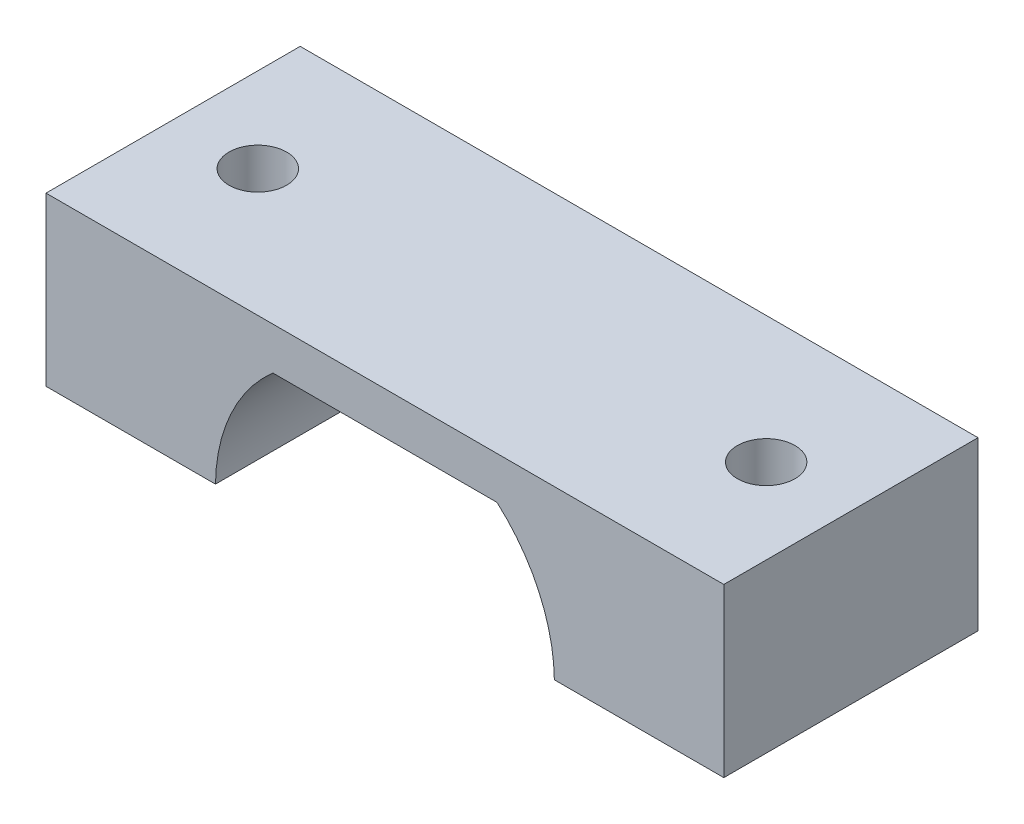
ISO-10303-21;
HEADER;
FILE_DESCRIPTION(('STEP AP214'),'2;1');
FILE_NAME('part.step','',(''),(''),'','','');
FILE_SCHEMA(('AUTOMOTIVE_DESIGN { 1 0 10303 214 1 1 1 1 }'));
ENDSEC;
DATA;
#1=APPLICATION_CONTEXT('core data for automotive mechanical design processes');
#2=APPLICATION_PROTOCOL_DEFINITION('international standard','automotive_design',2000,#1);
#3=PRODUCT_CONTEXT('',#1,'mechanical');
#4=PRODUCT('Part','Part','',(#3));
#5=PRODUCT_RELATED_PRODUCT_CATEGORY('part','',(#4));
#6=PRODUCT_DEFINITION_FORMATION('','',#4);
#7=PRODUCT_DEFINITION_CONTEXT('part definition',#1,'design');
#8=PRODUCT_DEFINITION('design','',#6,#7);
#9=PRODUCT_DEFINITION_SHAPE('','',#8);
#10=(LENGTH_UNIT() NAMED_UNIT(*) SI_UNIT(.MILLI.,.METRE.));
#11=(NAMED_UNIT(*) PLANE_ANGLE_UNIT() SI_UNIT($,.RADIAN.));
#12=(NAMED_UNIT(*) SI_UNIT($,.STERADIAN.) SOLID_ANGLE_UNIT());
#13=UNCERTAINTY_MEASURE_WITH_UNIT(LENGTH_MEASURE(1.E-05),#10,'distance_accuracy_value','');
#14=(GEOMETRIC_REPRESENTATION_CONTEXT(3) GLOBAL_UNCERTAINTY_ASSIGNED_CONTEXT((#13)) GLOBAL_UNIT_ASSIGNED_CONTEXT((#10,
#11,#12)) REPRESENTATION_CONTEXT('',''));
#15=CARTESIAN_POINT('',(0.,0.,0.));
#16=DIRECTION('',(0.,0.,1.));
#17=DIRECTION('',(1.,0.,0.));
#18=AXIS2_PLACEMENT_3D('',#15,#16,#17);
#19=CARTESIAN_POINT('',(0.,0.,7.5));
#20=DIRECTION('',(0.,0.,-1.));
#21=DIRECTION('',(-1.,0.,0.));
#22=AXIS2_PLACEMENT_3D('',#19,#20,#21);
#23=CYLINDRICAL_SURFACE('',#22,10.);
#24=CARTESIAN_POINT('',(0.,0.,-7.5));
#25=DIRECTION('',(0.,0.,-1.));
#26=DIRECTION('',(1.,0.,0.));
#27=AXIS2_PLACEMENT_3D('',#24,#25,#26);
#28=CIRCLE('',#27,10.);
#29=CARTESIAN_POINT('',(-9.99921871948004,0.125,-7.5));
#30=VERTEX_POINT('',#29);
#31=CARTESIAN_POINT('',(-6.61437827766148,7.5,-7.5));
#32=VERTEX_POINT('',#31);
#33=EDGE_CURVE('E140',#30,#32,#28,.T.);
#34=ORIENTED_EDGE('',*,*,#33,.T.);
#35=DIRECTION('',(0.,0.,-1.));
#36=VECTOR('',#35,1.);
#37=CARTESIAN_POINT('',(-6.61437827766148,7.5,7.5));
#38=LINE('',#37,#36);
#39=CARTESIAN_POINT('',(-6.61437827766148,7.5,7.5));
#40=VERTEX_POINT('',#39);
#41=EDGE_CURVE('E11',#40,#32,#38,.T.);
#42=ORIENTED_EDGE('',*,*,#41,.F.);
#43=CARTESIAN_POINT('',(0.,0.,7.5));
#44=DIRECTION('',(0.,0.,-1.));
#45=DIRECTION('',(1.,0.,0.));
#46=AXIS2_PLACEMENT_3D('',#43,#44,#45);
#47=CIRCLE('',#46,10.);
#48=CARTESIAN_POINT('',(-9.99921871948004,0.125,7.5));
#49=VERTEX_POINT('',#48);
#50=EDGE_CURVE('E163',#49,#40,#47,.T.);
#51=ORIENTED_EDGE('',*,*,#50,.F.);
#52=DIRECTION('',(0.,0.,-1.));
#53=VECTOR('',#52,1.);
#54=CARTESIAN_POINT('',(-9.99921871948004,0.125,7.5));
#55=LINE('',#54,#53);
#56=EDGE_CURVE('E136',#49,#30,#55,.T.);
#57=ORIENTED_EDGE('',*,*,#56,.T.);
#58=EDGE_LOOP('',(#34,#42,#51,#57));
#59=FACE_BOUND('',#58,.T.);
#60=ADVANCED_FACE('F39',(#59),#23,.F.);
#61=CARTESIAN_POINT('',(-6.61437827766148,7.5,7.5));
#62=DIRECTION('',(0.,1.,0.));
#63=DIRECTION('',(0.,0.,1.));
#64=AXIS2_PLACEMENT_3D('',#61,#62,#63);
#65=PLANE('',#64);
#66=DIRECTION('',(1.,0.,0.));
#67=VECTOR('',#66,1.);
#68=CARTESIAN_POINT('',(-6.61437827766148,7.5,-7.5));
#69=LINE('',#68,#67);
#70=CARTESIAN_POINT('',(6.61437827766148,7.5,-7.5));
#71=VERTEX_POINT('',#70);
#72=EDGE_CURVE('E144',#32,#71,#69,.T.);
#73=ORIENTED_EDGE('',*,*,#72,.T.);
#74=DIRECTION('',(0.,0.,-1.));
#75=VECTOR('',#74,1.);
#76=CARTESIAN_POINT('',(6.61437827766148,7.5,7.5));
#77=LINE('',#76,#75);
#78=CARTESIAN_POINT('',(6.61437827766148,7.5,7.5));
#79=VERTEX_POINT('',#78);
#80=EDGE_CURVE('E48',#79,#71,#77,.T.);
#81=ORIENTED_EDGE('',*,*,#80,.F.);
#82=DIRECTION('',(1.,0.,0.));
#83=VECTOR('',#82,1.);
#84=CARTESIAN_POINT('',(-6.61437827766148,7.5,7.5));
#85=LINE('',#84,#83);
#86=EDGE_CURVE('E99',#40,#79,#85,.T.);
#87=ORIENTED_EDGE('',*,*,#86,.F.);
#88=ORIENTED_EDGE('',*,*,#41,.T.);
#89=EDGE_LOOP('',(#73,#81,#87,#88));
#90=FACE_BOUND('',#89,.T.);
#91=ADVANCED_FACE('F245',(#90),#65,.F.);
#92=CARTESIAN_POINT('',(0.,0.,7.5));
#93=DIRECTION('',(0.,0.,-1.));
#94=DIRECTION('',(-1.,0.,0.));
#95=AXIS2_PLACEMENT_3D('',#92,#93,#94);
#96=CYLINDRICAL_SURFACE('',#95,10.);
#97=CARTESIAN_POINT('',(0.,0.,-7.5));
#98=DIRECTION('',(0.,0.,-1.));
#99=DIRECTION('',(1.,0.,0.));
#100=AXIS2_PLACEMENT_3D('',#97,#98,#99);
#101=CIRCLE('',#100,10.);
#102=CARTESIAN_POINT('',(9.99921871948004,0.125,-7.5));
#103=VERTEX_POINT('',#102);
#104=EDGE_CURVE('E148',#71,#103,#101,.T.);
#105=ORIENTED_EDGE('',*,*,#104,.T.);
#106=DIRECTION('',(0.,0.,-1.));
#107=VECTOR('',#106,1.);
#108=CARTESIAN_POINT('',(9.99921871948004,0.125,7.5));
#109=LINE('',#108,#107);
#110=CARTESIAN_POINT('',(9.99921871948004,0.125,7.5));
#111=VERTEX_POINT('',#110);
#112=EDGE_CURVE('E174',#111,#103,#109,.T.);
#113=ORIENTED_EDGE('',*,*,#112,.F.);
#114=CARTESIAN_POINT('',(0.,0.,7.5));
#115=DIRECTION('',(0.,0.,-1.));
#116=DIRECTION('',(1.,0.,0.));
#117=AXIS2_PLACEMENT_3D('',#114,#115,#116);
#118=CIRCLE('',#117,10.);
#119=EDGE_CURVE('E184',#79,#111,#118,.T.);
#120=ORIENTED_EDGE('',*,*,#119,.F.);
#121=ORIENTED_EDGE('',*,*,#80,.T.);
#122=EDGE_LOOP('',(#105,#113,#120,#121));
#123=FACE_BOUND('',#122,.T.);
#124=ADVANCED_FACE('F182',(#123),#96,.F.);
#125=CARTESIAN_POINT('',(9.99921871948004,0.125,7.5));
#126=DIRECTION('',(0.,1.,0.));
#127=DIRECTION('',(0.,0.,1.));
#128=AXIS2_PLACEMENT_3D('',#125,#126,#127);
#129=PLANE('',#128);
#130=CARTESIAN_POINT('',(15.,0.125,0.));
#131=DIRECTION('',(0.,1.,0.));
#132=DIRECTION('',(0.,0.,1.));
#133=AXIS2_PLACEMENT_3D('',#130,#131,#132);
#134=CIRCLE('',#133,1.7);
#135=CARTESIAN_POINT('',(15.,0.125,1.69999999999999));
#136=VERTEX_POINT('',#135);
#137=EDGE_CURVE('E211',#136,#136,#134,.T.);
#138=ORIENTED_EDGE('',*,*,#137,.T.);
#139=EDGE_LOOP('',(#138));
#140=FACE_BOUND('',#139,.T.);
#141=DIRECTION('',(1.,0.,0.));
#142=VECTOR('',#141,1.);
#143=CARTESIAN_POINT('',(9.99921871948004,0.125,-7.5));
#144=LINE('',#143,#142);
#145=CARTESIAN_POINT('',(20.,0.125,-7.5));
#146=VERTEX_POINT('',#145);
#147=EDGE_CURVE('E151',#103,#146,#144,.T.);
#148=ORIENTED_EDGE('',*,*,#147,.T.);
#149=DIRECTION('',(0.,0.,-1.));
#150=VECTOR('',#149,1.);
#151=CARTESIAN_POINT('',(20.,0.125,7.5));
#152=LINE('',#151,#150);
#153=CARTESIAN_POINT('',(20.,0.125,7.5));
#154=VERTEX_POINT('',#153);
#155=EDGE_CURVE('E170',#154,#146,#152,.T.);
#156=ORIENTED_EDGE('',*,*,#155,.F.);
#157=DIRECTION('',(1.,0.,0.));
#158=VECTOR('',#157,1.);
#159=CARTESIAN_POINT('',(9.99921871948004,0.125,7.5));
#160=LINE('',#159,#158);
#161=EDGE_CURVE('E197',#111,#154,#160,.T.);
#162=ORIENTED_EDGE('',*,*,#161,.F.);
#163=ORIENTED_EDGE('',*,*,#112,.T.);
#164=EDGE_LOOP('',(#148,#156,#162,#163));
#165=FACE_BOUND('',#164,.T.);
#166=ADVANCED_FACE('F192',(#140,#165),#129,.F.);
#167=CARTESIAN_POINT('',(20.,10.,7.5));
#168=DIRECTION('',(-1.,0.,0.));
#169=DIRECTION('',(0.,-1.,0.));
#170=AXIS2_PLACEMENT_3D('',#167,#168,#169);
#171=PLANE('',#170);
#172=DIRECTION('',(0.,1.,0.));
#173=VECTOR('',#172,1.);
#174=CARTESIAN_POINT('',(20.,10.,-7.5));
#175=LINE('',#174,#173);
#176=CARTESIAN_POINT('',(20.,10.,-7.5));
#177=VERTEX_POINT('',#176);
#178=EDGE_CURVE('E154',#146,#177,#175,.T.);
#179=ORIENTED_EDGE('',*,*,#178,.T.);
#180=DIRECTION('',(0.,0.,-1.));
#181=VECTOR('',#180,1.);
#182=CARTESIAN_POINT('',(20.,10.,7.5));
#183=LINE('',#182,#181);
#184=CARTESIAN_POINT('',(20.,10.,7.5));
#185=VERTEX_POINT('',#184);
#186=EDGE_CURVE('E129',#185,#177,#183,.T.);
#187=ORIENTED_EDGE('',*,*,#186,.F.);
#188=DIRECTION('',(0.,1.,0.));
#189=VECTOR('',#188,1.);
#190=CARTESIAN_POINT('',(20.,10.,7.5));
#191=LINE('',#190,#189);
#192=EDGE_CURVE('E118',#154,#185,#191,.T.);
#193=ORIENTED_EDGE('',*,*,#192,.F.);
#194=ORIENTED_EDGE('',*,*,#155,.T.);
#195=EDGE_LOOP('',(#179,#187,#193,#194));
#196=FACE_BOUND('',#195,.T.);
#197=ADVANCED_FACE('F195',(#196),#171,.F.);
#198=CARTESIAN_POINT('',(-20.,10.,7.5));
#199=DIRECTION('',(0.,-1.,0.));
#200=DIRECTION('',(0.,0.,-1.));
#201=AXIS2_PLACEMENT_3D('',#198,#199,#200);
#202=PLANE('',#201);
#203=CARTESIAN_POINT('',(-15.,10.,0.));
#204=DIRECTION('',(0.,1.,0.));
#205=DIRECTION('',(0.,0.,1.));
#206=AXIS2_PLACEMENT_3D('',#203,#204,#205);
#207=CIRCLE('',#206,1.7);
#208=CARTESIAN_POINT('',(-15.,10.,1.7));
#209=VERTEX_POINT('',#208);
#210=EDGE_CURVE('E215',#209,#209,#207,.T.);
#211=ORIENTED_EDGE('',*,*,#210,.F.);
#212=EDGE_LOOP('',(#211));
#213=FACE_BOUND('',#212,.T.);
#214=CARTESIAN_POINT('',(15.,10.,0.));
#215=DIRECTION('',(0.,1.,0.));
#216=DIRECTION('',(0.,0.,1.));
#217=AXIS2_PLACEMENT_3D('',#214,#215,#216);
#218=CIRCLE('',#217,1.7);
#219=CARTESIAN_POINT('',(15.,10.,1.69999999999999));
#220=VERTEX_POINT('',#219);
#221=EDGE_CURVE('E207',#220,#220,#218,.T.);
#222=ORIENTED_EDGE('',*,*,#221,.F.);
#223=EDGE_LOOP('',(#222));
#224=FACE_BOUND('',#223,.T.);
#225=DIRECTION('',(-1.,0.,0.));
#226=VECTOR('',#225,1.);
#227=CARTESIAN_POINT('',(-20.,10.,-7.5));
#228=LINE('',#227,#226);
#229=CARTESIAN_POINT('',(-20.,10.,-7.5));
#230=VERTEX_POINT('',#229);
#231=EDGE_CURVE('E127',#177,#230,#228,.T.);
#232=ORIENTED_EDGE('',*,*,#231,.T.);
#233=DIRECTION('',(0.,0.,-1.));
#234=VECTOR('',#233,1.);
#235=CARTESIAN_POINT('',(-20.,10.,7.5));
#236=LINE('',#235,#234);
#237=CARTESIAN_POINT('',(-20.,10.,7.5));
#238=VERTEX_POINT('',#237);
#239=EDGE_CURVE('E124',#238,#230,#236,.T.);
#240=ORIENTED_EDGE('',*,*,#239,.F.);
#241=DIRECTION('',(-1.,0.,0.));
#242=VECTOR('',#241,1.);
#243=CARTESIAN_POINT('',(-20.,10.,7.5));
#244=LINE('',#243,#242);
#245=EDGE_CURVE('E112',#185,#238,#244,.T.);
#246=ORIENTED_EDGE('',*,*,#245,.F.);
#247=ORIENTED_EDGE('',*,*,#186,.T.);
#248=EDGE_LOOP('',(#232,#240,#246,#247));
#249=FACE_BOUND('',#248,.T.);
#250=ADVANCED_FACE('F125',(#213,#224,#249),#202,.F.);
#251=CARTESIAN_POINT('',(-20.,0.125,7.5));
#252=DIRECTION('',(1.,0.,0.));
#253=DIRECTION('',(0.,1.,0.));
#254=AXIS2_PLACEMENT_3D('',#251,#252,#253);
#255=PLANE('',#254);
#256=DIRECTION('',(0.,-1.,0.));
#257=VECTOR('',#256,1.);
#258=CARTESIAN_POINT('',(-20.,0.125,-7.5));
#259=LINE('',#258,#257);
#260=CARTESIAN_POINT('',(-20.,0.125,-7.5));
#261=VERTEX_POINT('',#260);
#262=EDGE_CURVE('E85',#230,#261,#259,.T.);
#263=ORIENTED_EDGE('',*,*,#262,.T.);
#264=DIRECTION('',(0.,0.,-1.));
#265=VECTOR('',#264,1.);
#266=CARTESIAN_POINT('',(-20.,0.125,7.5));
#267=LINE('',#266,#265);
#268=CARTESIAN_POINT('',(-20.,0.125,7.5));
#269=VERTEX_POINT('',#268);
#270=EDGE_CURVE('E130',#269,#261,#267,.T.);
#271=ORIENTED_EDGE('',*,*,#270,.F.);
#272=DIRECTION('',(0.,-1.,0.));
#273=VECTOR('',#272,1.);
#274=CARTESIAN_POINT('',(-20.,0.125,7.5));
#275=LINE('',#274,#273);
#276=EDGE_CURVE('E116',#238,#269,#275,.T.);
#277=ORIENTED_EDGE('',*,*,#276,.F.);
#278=ORIENTED_EDGE('',*,*,#239,.T.);
#279=EDGE_LOOP('',(#263,#271,#277,#278));
#280=FACE_BOUND('',#279,.T.);
#281=ADVANCED_FACE('F132',(#280),#255,.F.);
#282=CARTESIAN_POINT('',(-20.,0.125,7.5));
#283=DIRECTION('',(0.,1.,0.));
#284=DIRECTION('',(0.,0.,1.));
#285=AXIS2_PLACEMENT_3D('',#282,#283,#284);
#286=PLANE('',#285);
#287=CARTESIAN_POINT('',(-15.,0.125,0.));
#288=DIRECTION('',(0.,1.,0.));
#289=DIRECTION('',(0.,0.,1.));
#290=AXIS2_PLACEMENT_3D('',#287,#288,#289);
#291=CIRCLE('',#290,1.7);
#292=CARTESIAN_POINT('',(-15.,0.125,1.7));
#293=VERTEX_POINT('',#292);
#294=EDGE_CURVE('E145',#293,#293,#291,.T.);
#295=ORIENTED_EDGE('',*,*,#294,.T.);
#296=EDGE_LOOP('',(#295));
#297=FACE_BOUND('',#296,.T.);
#298=DIRECTION('',(1.,0.,0.));
#299=VECTOR('',#298,1.);
#300=CARTESIAN_POINT('',(-20.,0.125,-7.5));
#301=LINE('',#300,#299);
#302=EDGE_CURVE('E91',#261,#30,#301,.T.);
#303=ORIENTED_EDGE('',*,*,#302,.T.);
#304=ORIENTED_EDGE('',*,*,#56,.F.);
#305=DIRECTION('',(1.,0.,0.));
#306=VECTOR('',#305,1.);
#307=CARTESIAN_POINT('',(-20.,0.125,7.5));
#308=LINE('',#307,#306);
#309=EDGE_CURVE('E56',#269,#49,#308,.T.);
#310=ORIENTED_EDGE('',*,*,#309,.F.);
#311=ORIENTED_EDGE('',*,*,#270,.T.);
#312=EDGE_LOOP('',(#303,#304,#310,#311));
#313=FACE_BOUND('',#312,.T.);
#314=ADVANCED_FACE('F223',(#297,#313),#286,.F.);
#315=CARTESIAN_POINT('',(0.,0.,7.5));
#316=DIRECTION('',(0.,0.,1.));
#317=DIRECTION('',(1.,0.,0.));
#318=AXIS2_PLACEMENT_3D('',#315,#316,#317);
#319=PLANE('',#318);
#320=ORIENTED_EDGE('',*,*,#50,.T.);
#321=ORIENTED_EDGE('',*,*,#86,.T.);
#322=ORIENTED_EDGE('',*,*,#119,.T.);
#323=ORIENTED_EDGE('',*,*,#161,.T.);
#324=ORIENTED_EDGE('',*,*,#192,.T.);
#325=ORIENTED_EDGE('',*,*,#245,.T.);
#326=ORIENTED_EDGE('',*,*,#276,.T.);
#327=ORIENTED_EDGE('',*,*,#309,.T.);
#328=EDGE_LOOP('',(#320,#321,#322,#323,#324,#325,#326,#327));
#329=FACE_BOUND('',#328,.T.);
#330=ADVANCED_FACE('F114',(#329),#319,.T.);
#331=CARTESIAN_POINT('',(0.,0.,-7.5));
#332=DIRECTION('',(0.,0.,1.));
#333=DIRECTION('',(1.,0.,0.));
#334=AXIS2_PLACEMENT_3D('',#331,#332,#333);
#335=PLANE('',#334);
#336=ORIENTED_EDGE('',*,*,#33,.F.);
#337=ORIENTED_EDGE('',*,*,#302,.F.);
#338=ORIENTED_EDGE('',*,*,#262,.F.);
#339=ORIENTED_EDGE('',*,*,#231,.F.);
#340=ORIENTED_EDGE('',*,*,#178,.F.);
#341=ORIENTED_EDGE('',*,*,#147,.F.);
#342=ORIENTED_EDGE('',*,*,#104,.F.);
#343=ORIENTED_EDGE('',*,*,#72,.F.);
#344=EDGE_LOOP('',(#336,#337,#338,#339,#340,#341,#342,#343));
#345=FACE_BOUND('',#344,.T.);
#346=ADVANCED_FACE('F188',(#345),#335,.F.);
#347=CARTESIAN_POINT('',(-15.,0.125,0.));
#348=DIRECTION('',(0.,1.,0.));
#349=DIRECTION('',(0.,0.,1.));
#350=AXIS2_PLACEMENT_3D('',#347,#348,#349);
#351=CYLINDRICAL_SURFACE('',#350,1.7);
#352=ORIENTED_EDGE('',*,*,#294,.F.);
#353=EDGE_LOOP('',(#352));
#354=FACE_BOUND('',#353,.T.);
#355=ORIENTED_EDGE('',*,*,#210,.T.);
#356=EDGE_LOOP('',(#355));
#357=FACE_BOUND('',#356,.T.);
#358=ADVANCED_FACE('F225',(#354,#357),#351,.F.);
#359=CARTESIAN_POINT('',(15.,0.125,0.));
#360=DIRECTION('',(0.,1.,0.));
#361=DIRECTION('',(0.,0.,1.));
#362=AXIS2_PLACEMENT_3D('',#359,#360,#361);
#363=CYLINDRICAL_SURFACE('',#362,1.7);
#364=ORIENTED_EDGE('',*,*,#137,.F.);
#365=EDGE_LOOP('',(#364));
#366=FACE_BOUND('',#365,.T.);
#367=ORIENTED_EDGE('',*,*,#221,.T.);
#368=EDGE_LOOP('',(#367));
#369=FACE_BOUND('',#368,.T.);
#370=ADVANCED_FACE('F228',(#366,#369),#363,.F.);
#371=CLOSED_SHELL('',(#60,#91,#124,#166,#197,#250,#281,#314,#330,#346,#358,#370));
#372=MANIFOLD_SOLID_BREP('B2',#371);
#373=ADVANCED_BREP_SHAPE_REPRESENTATION('',(#18,#372),#14);
#374=SHAPE_DEFINITION_REPRESENTATION(#9,#373);
ENDSEC;
END-ISO-10303-21;
